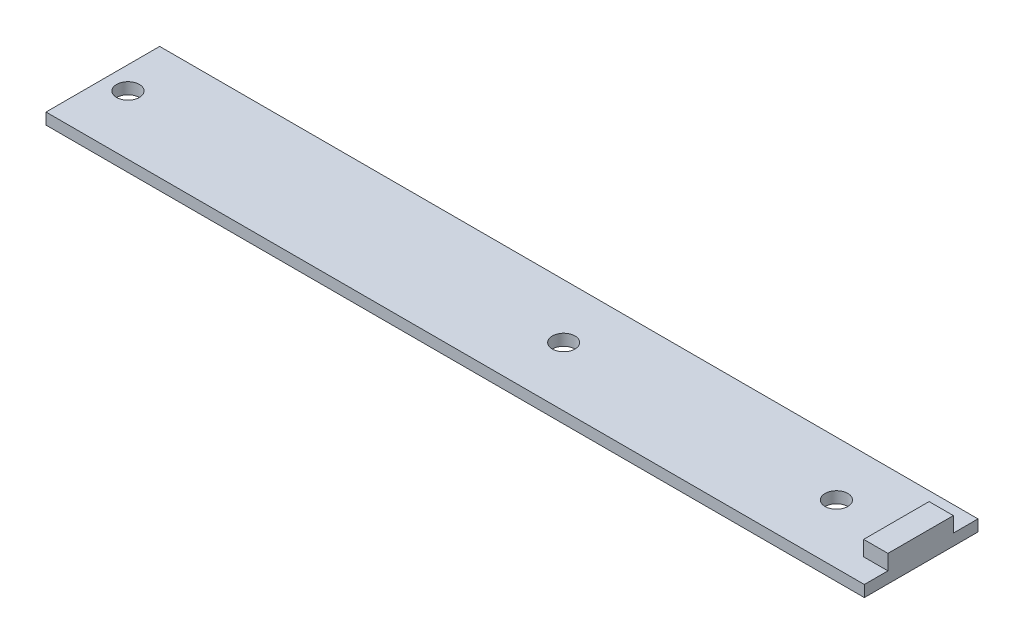
ISO-10303-21;
HEADER;
FILE_DESCRIPTION(('STEP AP214'),'2;1');
FILE_NAME('part.step','',(''),(''),'','','');
FILE_SCHEMA(('AUTOMOTIVE_DESIGN { 1 0 10303 214 1 1 1 1 }'));
ENDSEC;
DATA;
#1=APPLICATION_CONTEXT('core data for automotive mechanical design processes');
#2=APPLICATION_PROTOCOL_DEFINITION('international standard','automotive_design',2000,#1);
#3=PRODUCT_CONTEXT('',#1,'mechanical');
#4=PRODUCT('Part','Part','',(#3));
#5=PRODUCT_RELATED_PRODUCT_CATEGORY('part','',(#4));
#6=PRODUCT_DEFINITION_FORMATION('','',#4);
#7=PRODUCT_DEFINITION_CONTEXT('part definition',#1,'design');
#8=PRODUCT_DEFINITION('design','',#6,#7);
#9=PRODUCT_DEFINITION_SHAPE('','',#8);
#10=(LENGTH_UNIT() NAMED_UNIT(*) SI_UNIT(.MILLI.,.METRE.));
#11=(NAMED_UNIT(*) PLANE_ANGLE_UNIT() SI_UNIT($,.RADIAN.));
#12=(NAMED_UNIT(*) SI_UNIT($,.STERADIAN.) SOLID_ANGLE_UNIT());
#13=UNCERTAINTY_MEASURE_WITH_UNIT(LENGTH_MEASURE(1.E-05),#10,'distance_accuracy_value','');
#14=(GEOMETRIC_REPRESENTATION_CONTEXT(3) GLOBAL_UNCERTAINTY_ASSIGNED_CONTEXT((#13)) GLOBAL_UNIT_ASSIGNED_CONTEXT((#10,
#11,#12)) REPRESENTATION_CONTEXT('',''));
#15=CARTESIAN_POINT('',(0.,0.,0.));
#16=DIRECTION('',(0.,0.,1.));
#17=DIRECTION('',(1.,0.,0.));
#18=AXIS2_PLACEMENT_3D('',#15,#16,#17);
#19=CARTESIAN_POINT('',(0.,1.5,0.));
#20=DIRECTION('',(1.,0.,0.));
#21=DIRECTION('',(0.,0.,-1.));
#22=AXIS2_PLACEMENT_3D('',#19,#20,#21);
#23=PLANE('',#22);
#24=DIRECTION('',(0.,0.,1.));
#25=VECTOR('',#24,1.);
#26=CARTESIAN_POINT('',(0.,0.,0.));
#27=LINE('',#26,#25);
#28=CARTESIAN_POINT('',(0.,0.,0.));
#29=VERTEX_POINT('',#28);
#30=CARTESIAN_POINT('',(0.,0.,15.));
#31=VERTEX_POINT('',#30);
#32=EDGE_CURVE('E119',#29,#31,#27,.T.);
#33=ORIENTED_EDGE('',*,*,#32,.T.);
#34=DIRECTION('',(0.,-1.,0.));
#35=VECTOR('',#34,1.);
#36=CARTESIAN_POINT('',(0.,1.5,15.));
#37=LINE('',#36,#35);
#38=CARTESIAN_POINT('',(0.,1.5,15.));
#39=VERTEX_POINT('',#38);
#40=EDGE_CURVE('E11',#39,#31,#37,.T.);
#41=ORIENTED_EDGE('',*,*,#40,.F.);
#42=DIRECTION('',(0.,0.,1.));
#43=VECTOR('',#42,1.);
#44=CARTESIAN_POINT('',(0.,1.5,0.));
#45=LINE('',#44,#43);
#46=CARTESIAN_POINT('',(0.,1.5,0.));
#47=VERTEX_POINT('',#46);
#48=EDGE_CURVE('E128',#47,#39,#45,.T.);
#49=ORIENTED_EDGE('',*,*,#48,.F.);
#50=DIRECTION('',(0.,-1.,0.));
#51=VECTOR('',#50,1.);
#52=CARTESIAN_POINT('',(0.,1.5,0.));
#53=LINE('',#52,#51);
#54=EDGE_CURVE('E137',#47,#29,#53,.T.);
#55=ORIENTED_EDGE('',*,*,#54,.T.);
#56=EDGE_LOOP('',(#33,#41,#49,#55));
#57=FACE_BOUND('',#56,.T.);
#58=ADVANCED_FACE('F33',(#57),#23,.F.);
#59=CARTESIAN_POINT('',(0.,1.5,15.));
#60=DIRECTION('',(0.,0.,-1.));
#61=DIRECTION('',(-1.,0.,0.));
#62=AXIS2_PLACEMENT_3D('',#59,#60,#61);
#63=PLANE('',#62);
#64=DIRECTION('',(1.,0.,0.));
#65=VECTOR('',#64,1.);
#66=CARTESIAN_POINT('',(0.,0.,15.));
#67=LINE('',#66,#65);
#68=CARTESIAN_POINT('',(108.,0.,15.));
#69=VERTEX_POINT('',#68);
#70=EDGE_CURVE('E122',#31,#69,#67,.T.);
#71=ORIENTED_EDGE('',*,*,#70,.T.);
#72=DIRECTION('',(0.,-1.,0.));
#73=VECTOR('',#72,1.);
#74=CARTESIAN_POINT('',(108.,1.5,15.));
#75=LINE('',#74,#73);
#76=CARTESIAN_POINT('',(108.,1.5,15.));
#77=VERTEX_POINT('',#76);
#78=EDGE_CURVE('E40',#77,#69,#75,.T.);
#79=ORIENTED_EDGE('',*,*,#78,.F.);
#80=DIRECTION('',(1.,0.,0.));
#81=VECTOR('',#80,1.);
#82=CARTESIAN_POINT('',(0.,1.5,15.));
#83=LINE('',#82,#81);
#84=EDGE_CURVE('E131',#39,#77,#83,.T.);
#85=ORIENTED_EDGE('',*,*,#84,.F.);
#86=ORIENTED_EDGE('',*,*,#40,.T.);
#87=EDGE_LOOP('',(#71,#79,#85,#86));
#88=FACE_BOUND('',#87,.T.);
#89=ADVANCED_FACE('F164',(#88),#63,.F.);
#90=CARTESIAN_POINT('',(108.,1.5,0.));
#91=DIRECTION('',(-1.,0.,0.));
#92=DIRECTION('',(0.,0.,1.));
#93=AXIS2_PLACEMENT_3D('',#90,#91,#92);
#94=PLANE('',#93);
#95=DIRECTION('',(0.,0.,-1.));
#96=VECTOR('',#95,1.);
#97=CARTESIAN_POINT('',(108.,0.,0.));
#98=LINE('',#97,#96);
#99=CARTESIAN_POINT('',(108.,0.,0.));
#100=VERTEX_POINT('',#99);
#101=EDGE_CURVE('E140',#69,#100,#98,.T.);
#102=ORIENTED_EDGE('',*,*,#101,.T.);
#103=DIRECTION('',(0.,-1.,0.));
#104=VECTOR('',#103,1.);
#105=CARTESIAN_POINT('',(108.,1.5,0.));
#106=LINE('',#105,#104);
#107=CARTESIAN_POINT('',(108.,1.5,0.));
#108=VERTEX_POINT('',#107);
#109=EDGE_CURVE('E145',#108,#100,#106,.T.);
#110=ORIENTED_EDGE('',*,*,#109,.F.);
#111=DIRECTION('',(0.,0.,-1.));
#112=VECTOR('',#111,1.);
#113=CARTESIAN_POINT('',(108.,1.5,0.));
#114=LINE('',#113,#112);
#115=CARTESIAN_POINT('',(108.,1.5,3.24986972221097));
#116=VERTEX_POINT('',#115);
#117=EDGE_CURVE('E118',#116,#108,#114,.T.);
#118=ORIENTED_EDGE('',*,*,#117,.F.);
#119=DIRECTION('',(0.,-1.,0.));
#120=VECTOR('',#119,1.);
#121=CARTESIAN_POINT('',(108.,3.5,3.24986972221097));
#122=LINE('',#121,#120);
#123=CARTESIAN_POINT('',(108.,3.5,3.24986972221097));
#124=VERTEX_POINT('',#123);
#125=EDGE_CURVE('E100',#124,#116,#122,.T.);
#126=ORIENTED_EDGE('',*,*,#125,.F.);
#127=DIRECTION('',(0.,0.,-1.));
#128=VECTOR('',#127,1.);
#129=CARTESIAN_POINT('',(108.,3.5,11.8867836146705));
#130=LINE('',#129,#128);
#131=CARTESIAN_POINT('',(108.,3.5,11.8867836146705));
#132=VERTEX_POINT('',#131);
#133=EDGE_CURVE('E106',#132,#124,#130,.T.);
#134=ORIENTED_EDGE('',*,*,#133,.F.);
#135=DIRECTION('',(0.,-1.,0.));
#136=VECTOR('',#135,1.);
#137=CARTESIAN_POINT('',(108.,3.5,11.8867836146705));
#138=LINE('',#137,#136);
#139=CARTESIAN_POINT('',(108.,1.5,11.8867836146705));
#140=VERTEX_POINT('',#139);
#141=EDGE_CURVE('E229',#132,#140,#138,.T.);
#142=ORIENTED_EDGE('',*,*,#141,.T.);
#143=EDGE_CURVE('E134',#77,#140,#114,.T.);
#144=ORIENTED_EDGE('',*,*,#143,.F.);
#145=ORIENTED_EDGE('',*,*,#78,.T.);
#146=EDGE_LOOP('',(#102,#110,#118,#126,#134,#142,#144,#145));
#147=FACE_BOUND('',#146,.T.);
#148=ADVANCED_FACE('F116',(#147),#94,.F.);
#149=CARTESIAN_POINT('',(0.,1.5,0.));
#150=DIRECTION('',(0.,0.,1.));
#151=DIRECTION('',(1.,0.,0.));
#152=AXIS2_PLACEMENT_3D('',#149,#150,#151);
#153=PLANE('',#152);
#154=DIRECTION('',(-1.,0.,0.));
#155=VECTOR('',#154,1.);
#156=CARTESIAN_POINT('',(0.,0.,0.));
#157=LINE('',#156,#155);
#158=EDGE_CURVE('E132',#100,#29,#157,.T.);
#159=ORIENTED_EDGE('',*,*,#158,.T.);
#160=ORIENTED_EDGE('',*,*,#54,.F.);
#161=DIRECTION('',(-1.,0.,0.));
#162=VECTOR('',#161,1.);
#163=CARTESIAN_POINT('',(0.,1.5,0.));
#164=LINE('',#163,#162);
#165=EDGE_CURVE('E136',#108,#47,#164,.T.);
#166=ORIENTED_EDGE('',*,*,#165,.F.);
#167=ORIENTED_EDGE('',*,*,#109,.T.);
#168=EDGE_LOOP('',(#159,#160,#166,#167));
#169=FACE_BOUND('',#168,.T.);
#170=ADVANCED_FACE('F158',(#169),#153,.F.);
#171=CARTESIAN_POINT('',(0.,1.5,0.));
#172=DIRECTION('',(0.,1.,0.));
#173=DIRECTION('',(0.,0.,1.));
#174=AXIS2_PLACEMENT_3D('',#171,#172,#173);
#175=PLANE('',#174);
#176=CARTESIAN_POINT('',(60.5,1.5,7.18095968593957));
#177=DIRECTION('',(0.,1.,0.));
#178=DIRECTION('',(0.,0.,1.));
#179=AXIS2_PLACEMENT_3D('',#176,#177,#178);
#180=CIRCLE('',#179,1.5);
#181=CARTESIAN_POINT('',(60.5,1.5,8.68095968593958));
#182=VERTEX_POINT('',#181);
#183=EDGE_CURVE('E208',#182,#182,#180,.T.);
#184=ORIENTED_EDGE('',*,*,#183,.F.);
#185=EDGE_LOOP('',(#184));
#186=FACE_BOUND('',#185,.T.);
#187=CARTESIAN_POINT('',(96.5,1.5,7.18095968593957));
#188=DIRECTION('',(0.,1.,0.));
#189=DIRECTION('',(0.,0.,1.));
#190=AXIS2_PLACEMENT_3D('',#187,#188,#189);
#191=CIRCLE('',#190,1.5);
#192=CARTESIAN_POINT('',(96.5,1.5,8.68095968593957));
#193=VERTEX_POINT('',#192);
#194=EDGE_CURVE('E212',#193,#193,#191,.T.);
#195=ORIENTED_EDGE('',*,*,#194,.F.);
#196=EDGE_LOOP('',(#195));
#197=FACE_BOUND('',#196,.T.);
#198=CARTESIAN_POINT('',(3.,1.5,7.18095968593957));
#199=DIRECTION('',(0.,1.,0.));
#200=DIRECTION('',(0.,0.,1.));
#201=AXIS2_PLACEMENT_3D('',#198,#199,#200);
#202=CIRCLE('',#201,1.5);
#203=CARTESIAN_POINT('',(3.,1.5,8.68095968593957));
#204=VERTEX_POINT('',#203);
#205=EDGE_CURVE('E224',#204,#204,#202,.T.);
#206=ORIENTED_EDGE('',*,*,#205,.F.);
#207=EDGE_LOOP('',(#206));
#208=FACE_BOUND('',#207,.T.);
#209=DIRECTION('',(1.,0.,0.));
#210=VECTOR('',#209,1.);
#211=CARTESIAN_POINT('',(108.,1.5,11.8867836146705));
#212=LINE('',#211,#210);
#213=CARTESIAN_POINT('',(104.797069777533,1.5,11.8867836146705));
#214=VERTEX_POINT('',#213);
#215=EDGE_CURVE('E47',#214,#140,#212,.T.);
#216=ORIENTED_EDGE('',*,*,#215,.F.);
#217=DIRECTION('',(0.,0.,1.));
#218=VECTOR('',#217,1.);
#219=CARTESIAN_POINT('',(104.797069777533,1.5,11.8867836146705));
#220=LINE('',#219,#218);
#221=CARTESIAN_POINT('',(104.797069777533,1.5,3.24986972221097));
#222=VERTEX_POINT('',#221);
#223=EDGE_CURVE('E231',#222,#214,#220,.T.);
#224=ORIENTED_EDGE('',*,*,#223,.F.);
#225=DIRECTION('',(-1.,0.,0.));
#226=VECTOR('',#225,1.);
#227=CARTESIAN_POINT('',(108.,1.5,3.24986972221097));
#228=LINE('',#227,#226);
#229=EDGE_CURVE('E53',#116,#222,#228,.T.);
#230=ORIENTED_EDGE('',*,*,#229,.F.);
#231=ORIENTED_EDGE('',*,*,#117,.T.);
#232=ORIENTED_EDGE('',*,*,#165,.T.);
#233=ORIENTED_EDGE('',*,*,#48,.T.);
#234=ORIENTED_EDGE('',*,*,#84,.T.);
#235=ORIENTED_EDGE('',*,*,#143,.T.);
#236=EDGE_LOOP('',(#216,#224,#230,#231,#232,#233,#234,#235));
#237=FACE_BOUND('',#236,.T.);
#238=ADVANCED_FACE('F163',(#186,#197,#208,#237),#175,.T.);
#239=CARTESIAN_POINT('',(0.,0.,0.));
#240=DIRECTION('',(0.,1.,0.));
#241=DIRECTION('',(0.,0.,1.));
#242=AXIS2_PLACEMENT_3D('',#239,#240,#241);
#243=PLANE('',#242);
#244=CARTESIAN_POINT('',(60.5,0.,7.18095968593957));
#245=DIRECTION('',(0.,-1.,0.));
#246=DIRECTION('',(0.,0.,-1.));
#247=AXIS2_PLACEMENT_3D('',#244,#245,#246);
#248=CIRCLE('',#247,1.5);
#249=CARTESIAN_POINT('',(60.5,0.,5.68095968593957));
#250=VERTEX_POINT('',#249);
#251=EDGE_CURVE('E211',#250,#250,#248,.T.);
#252=ORIENTED_EDGE('',*,*,#251,.F.);
#253=EDGE_LOOP('',(#252));
#254=FACE_BOUND('',#253,.T.);
#255=CARTESIAN_POINT('',(96.5,0.,7.18095968593957));
#256=DIRECTION('',(0.,-1.,0.));
#257=DIRECTION('',(0.,0.,-1.));
#258=AXIS2_PLACEMENT_3D('',#255,#256,#257);
#259=CIRCLE('',#258,1.5);
#260=CARTESIAN_POINT('',(96.5,0.,5.68095968593957));
#261=VERTEX_POINT('',#260);
#262=EDGE_CURVE('E213',#261,#261,#259,.T.);
#263=ORIENTED_EDGE('',*,*,#262,.F.);
#264=EDGE_LOOP('',(#263));
#265=FACE_BOUND('',#264,.T.);
#266=CARTESIAN_POINT('',(3.,0.,7.18095968593957));
#267=DIRECTION('',(0.,-1.,0.));
#268=DIRECTION('',(0.,0.,-1.));
#269=AXIS2_PLACEMENT_3D('',#266,#267,#268);
#270=CIRCLE('',#269,1.5);
#271=CARTESIAN_POINT('',(3.,0.,5.68095968593957));
#272=VERTEX_POINT('',#271);
#273=EDGE_CURVE('E221',#272,#272,#270,.T.);
#274=ORIENTED_EDGE('',*,*,#273,.F.);
#275=EDGE_LOOP('',(#274));
#276=FACE_BOUND('',#275,.T.);
#277=ORIENTED_EDGE('',*,*,#32,.F.);
#278=ORIENTED_EDGE('',*,*,#158,.F.);
#279=ORIENTED_EDGE('',*,*,#101,.F.);
#280=ORIENTED_EDGE('',*,*,#70,.F.);
#281=EDGE_LOOP('',(#277,#278,#279,#280));
#282=FACE_BOUND('',#281,.T.);
#283=ADVANCED_FACE('F155',(#254,#265,#276,#282),#243,.F.);
#284=CARTESIAN_POINT('',(108.,3.5,3.24986972221097));
#285=DIRECTION('',(0.,0.,1.));
#286=DIRECTION('',(1.,0.,0.));
#287=AXIS2_PLACEMENT_3D('',#284,#285,#286);
#288=PLANE('',#287);
#289=ORIENTED_EDGE('',*,*,#229,.T.);
#290=DIRECTION('',(0.,-1.,0.));
#291=VECTOR('',#290,1.);
#292=CARTESIAN_POINT('',(104.797069777533,3.5,3.24986972221097));
#293=LINE('',#292,#291);
#294=CARTESIAN_POINT('',(104.797069777533,3.5,3.24986972221097));
#295=VERTEX_POINT('',#294);
#296=EDGE_CURVE('E102',#295,#222,#293,.T.);
#297=ORIENTED_EDGE('',*,*,#296,.F.);
#298=DIRECTION('',(-1.,0.,0.));
#299=VECTOR('',#298,1.);
#300=CARTESIAN_POINT('',(108.,3.5,3.24986972221097));
#301=LINE('',#300,#299);
#302=EDGE_CURVE('E96',#124,#295,#301,.T.);
#303=ORIENTED_EDGE('',*,*,#302,.F.);
#304=ORIENTED_EDGE('',*,*,#125,.T.);
#305=EDGE_LOOP('',(#289,#297,#303,#304));
#306=FACE_BOUND('',#305,.T.);
#307=ADVANCED_FACE('F98',(#306),#288,.F.);
#308=CARTESIAN_POINT('',(104.797069777533,3.5,11.8867836146705));
#309=DIRECTION('',(1.,0.,0.));
#310=DIRECTION('',(0.,0.,-1.));
#311=AXIS2_PLACEMENT_3D('',#308,#309,#310);
#312=PLANE('',#311);
#313=ORIENTED_EDGE('',*,*,#223,.T.);
#314=DIRECTION('',(0.,-1.,0.));
#315=VECTOR('',#314,1.);
#316=CARTESIAN_POINT('',(104.797069777533,3.5,11.8867836146705));
#317=LINE('',#316,#315);
#318=CARTESIAN_POINT('',(104.797069777533,3.5,11.8867836146705));
#319=VERTEX_POINT('',#318);
#320=EDGE_CURVE('E124',#319,#214,#317,.T.);
#321=ORIENTED_EDGE('',*,*,#320,.F.);
#322=DIRECTION('',(0.,0.,1.));
#323=VECTOR('',#322,1.);
#324=CARTESIAN_POINT('',(104.797069777533,3.5,11.8867836146705));
#325=LINE('',#324,#323);
#326=EDGE_CURVE('E105',#295,#319,#325,.T.);
#327=ORIENTED_EDGE('',*,*,#326,.F.);
#328=ORIENTED_EDGE('',*,*,#296,.T.);
#329=EDGE_LOOP('',(#313,#321,#327,#328));
#330=FACE_BOUND('',#329,.T.);
#331=ADVANCED_FACE('F182',(#330),#312,.F.);
#332=CARTESIAN_POINT('',(108.,3.5,11.8867836146705));
#333=DIRECTION('',(0.,0.,-1.));
#334=DIRECTION('',(-1.,0.,0.));
#335=AXIS2_PLACEMENT_3D('',#332,#333,#334);
#336=PLANE('',#335);
#337=ORIENTED_EDGE('',*,*,#215,.T.);
#338=ORIENTED_EDGE('',*,*,#141,.F.);
#339=DIRECTION('',(1.,0.,0.));
#340=VECTOR('',#339,1.);
#341=CARTESIAN_POINT('',(108.,3.5,11.8867836146705));
#342=LINE('',#341,#340);
#343=EDGE_CURVE('E111',#319,#132,#342,.T.);
#344=ORIENTED_EDGE('',*,*,#343,.F.);
#345=ORIENTED_EDGE('',*,*,#320,.T.);
#346=EDGE_LOOP('',(#337,#338,#344,#345));
#347=FACE_BOUND('',#346,.T.);
#348=ADVANCED_FACE('F185',(#347),#336,.F.);
#349=CARTESIAN_POINT('',(0.,3.5,0.));
#350=DIRECTION('',(0.,1.,0.));
#351=DIRECTION('',(0.,0.,1.));
#352=AXIS2_PLACEMENT_3D('',#349,#350,#351);
#353=PLANE('',#352);
#354=ORIENTED_EDGE('',*,*,#133,.T.);
#355=ORIENTED_EDGE('',*,*,#302,.T.);
#356=ORIENTED_EDGE('',*,*,#326,.T.);
#357=ORIENTED_EDGE('',*,*,#343,.T.);
#358=EDGE_LOOP('',(#354,#355,#356,#357));
#359=FACE_BOUND('',#358,.T.);
#360=ADVANCED_FACE('F109',(#359),#353,.T.);
#361=CARTESIAN_POINT('',(3.,2.,7.18095968593957));
#362=DIRECTION('',(0.,-1.,0.));
#363=DIRECTION('',(0.,0.,-1.));
#364=AXIS2_PLACEMENT_3D('',#361,#362,#363);
#365=CYLINDRICAL_SURFACE('',#364,1.5);
#366=ORIENTED_EDGE('',*,*,#205,.T.);
#367=EDGE_LOOP('',(#366));
#368=FACE_BOUND('',#367,.T.);
#369=ORIENTED_EDGE('',*,*,#273,.T.);
#370=EDGE_LOOP('',(#369));
#371=FACE_BOUND('',#370,.T.);
#372=ADVANCED_FACE('F192',(#368,#371),#365,.F.);
#373=CARTESIAN_POINT('',(96.5,2.,7.18095968593957));
#374=DIRECTION('',(0.,-1.,0.));
#375=DIRECTION('',(0.,0.,-1.));
#376=AXIS2_PLACEMENT_3D('',#373,#374,#375);
#377=CYLINDRICAL_SURFACE('',#376,1.5);
#378=ORIENTED_EDGE('',*,*,#194,.T.);
#379=EDGE_LOOP('',(#378));
#380=FACE_BOUND('',#379,.T.);
#381=ORIENTED_EDGE('',*,*,#262,.T.);
#382=EDGE_LOOP('',(#381));
#383=FACE_BOUND('',#382,.T.);
#384=ADVANCED_FACE('F195',(#380,#383),#377,.F.);
#385=CARTESIAN_POINT('',(60.5,2.,7.18095968593957));
#386=DIRECTION('',(0.,-1.,0.));
#387=DIRECTION('',(0.,0.,-1.));
#388=AXIS2_PLACEMENT_3D('',#385,#386,#387);
#389=CYLINDRICAL_SURFACE('',#388,1.5);
#390=ORIENTED_EDGE('',*,*,#183,.T.);
#391=EDGE_LOOP('',(#390));
#392=FACE_BOUND('',#391,.T.);
#393=ORIENTED_EDGE('',*,*,#251,.T.);
#394=EDGE_LOOP('',(#393));
#395=FACE_BOUND('',#394,.T.);
#396=ADVANCED_FACE('F199',(#392,#395),#389,.F.);
#397=CLOSED_SHELL('',(#58,#89,#148,#170,#238,#283,#307,#331,#348,#360,#372,#384,#396));
#398=MANIFOLD_SOLID_BREP('B2',#397);
#399=ADVANCED_BREP_SHAPE_REPRESENTATION('',(#18,#398),#14);
#400=SHAPE_DEFINITION_REPRESENTATION(#9,#399);
ENDSEC;
END-ISO-10303-21;
